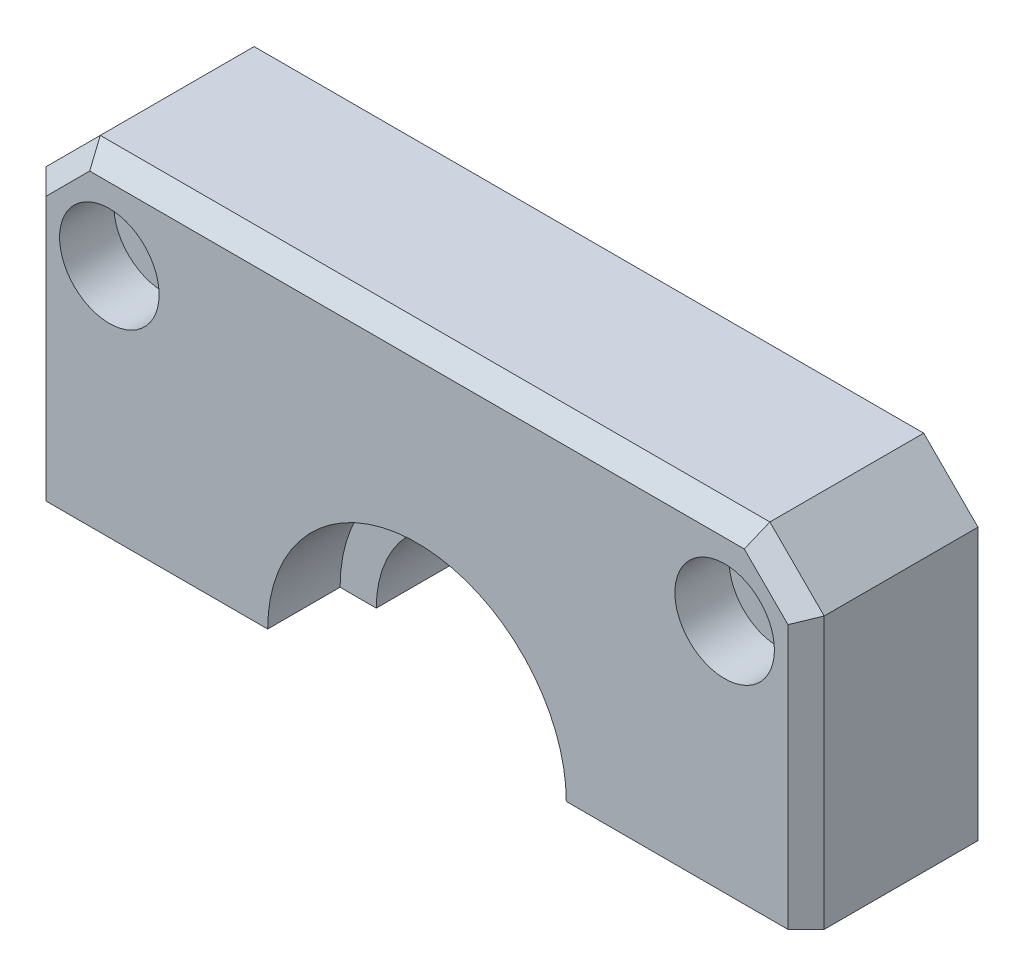
ISO-10303-21;
HEADER;
FILE_DESCRIPTION(('STEP AP214'),'2;1');
FILE_NAME('part.step','',(''),(''),'','','');
FILE_SCHEMA(('AUTOMOTIVE_DESIGN { 1 0 10303 214 1 1 1 1 }'));
ENDSEC;
DATA;
#1=APPLICATION_CONTEXT('core data for automotive mechanical design processes');
#2=APPLICATION_PROTOCOL_DEFINITION('international standard','automotive_design',2000,#1);
#3=PRODUCT_CONTEXT('',#1,'mechanical');
#4=PRODUCT('Part','Part','',(#3));
#5=PRODUCT_RELATED_PRODUCT_CATEGORY('part','',(#4));
#6=PRODUCT_DEFINITION_FORMATION('','',#4);
#7=PRODUCT_DEFINITION_CONTEXT('part definition',#1,'design');
#8=PRODUCT_DEFINITION('design','',#6,#7);
#9=PRODUCT_DEFINITION_SHAPE('','',#8);
#10=(LENGTH_UNIT() NAMED_UNIT(*) SI_UNIT(.MILLI.,.METRE.));
#11=(NAMED_UNIT(*) PLANE_ANGLE_UNIT() SI_UNIT($,.RADIAN.));
#12=(NAMED_UNIT(*) SI_UNIT($,.STERADIAN.) SOLID_ANGLE_UNIT());
#13=UNCERTAINTY_MEASURE_WITH_UNIT(LENGTH_MEASURE(1.E-05),#10,'distance_accuracy_value','');
#14=(GEOMETRIC_REPRESENTATION_CONTEXT(3) GLOBAL_UNCERTAINTY_ASSIGNED_CONTEXT((#13)) GLOBAL_UNIT_ASSIGNED_CONTEXT((#10,
#11,#12)) REPRESENTATION_CONTEXT('',''));
#15=CARTESIAN_POINT('',(0.,0.,0.));
#16=DIRECTION('',(0.,0.,1.));
#17=DIRECTION('',(1.,0.,0.));
#18=AXIS2_PLACEMENT_3D('',#15,#16,#17);
#19=CARTESIAN_POINT('',(17.,13.,58.5));
#20=DIRECTION('',(0.,0.,-1.));
#21=DIRECTION('',(-1.,0.,0.));
#22=AXIS2_PLACEMENT_3D('',#19,#20,#21);
#23=CYLINDRICAL_SURFACE('',#22,1.5);
#24=CARTESIAN_POINT('',(17.,13.,49.));
#25=DIRECTION('',(0.,0.,1.));
#26=DIRECTION('',(1.,0.,0.));
#27=AXIS2_PLACEMENT_3D('',#24,#25,#26);
#28=CIRCLE('',#27,1.5);
#29=CARTESIAN_POINT('',(18.5,13.,49.));
#30=VERTEX_POINT('',#29);
#31=EDGE_CURVE('E173',#30,#30,#28,.T.);
#32=ORIENTED_EDGE('',*,*,#31,.F.);
#33=EDGE_LOOP('',(#32));
#34=FACE_BOUND('',#33,.T.);
#35=CARTESIAN_POINT('',(17.,13.,55.5));
#36=DIRECTION('',(0.,0.,1.));
#37=DIRECTION('',(1.,0.,0.));
#38=AXIS2_PLACEMENT_3D('',#35,#36,#37);
#39=CIRCLE('',#38,1.5);
#40=CARTESIAN_POINT('',(18.5,13.,55.5));
#41=VERTEX_POINT('',#40);
#42=EDGE_CURVE('E222',#41,#41,#39,.T.);
#43=ORIENTED_EDGE('',*,*,#42,.T.);
#44=EDGE_LOOP('',(#43));
#45=FACE_BOUND('',#44,.T.);
#46=ADVANCED_FACE('F39',(#34,#45),#23,.F.);
#47=CARTESIAN_POINT('',(-17.,13.,58.5));
#48=DIRECTION('',(0.,0.,-1.));
#49=DIRECTION('',(-1.,0.,0.));
#50=AXIS2_PLACEMENT_3D('',#47,#48,#49);
#51=CYLINDRICAL_SURFACE('',#50,1.5);
#52=CARTESIAN_POINT('',(-17.,13.,49.));
#53=DIRECTION('',(0.,0.,1.));
#54=DIRECTION('',(1.,0.,0.));
#55=AXIS2_PLACEMENT_3D('',#52,#53,#54);
#56=CIRCLE('',#55,1.5);
#57=CARTESIAN_POINT('',(-15.5,13.,49.));
#58=VERTEX_POINT('',#57);
#59=EDGE_CURVE('E170',#58,#58,#56,.T.);
#60=ORIENTED_EDGE('',*,*,#59,.F.);
#61=EDGE_LOOP('',(#60));
#62=FACE_BOUND('',#61,.T.);
#63=CARTESIAN_POINT('',(-17.,13.,55.5));
#64=DIRECTION('',(0.,0.,1.));
#65=DIRECTION('',(1.,0.,0.));
#66=AXIS2_PLACEMENT_3D('',#63,#64,#65);
#67=CIRCLE('',#66,1.5);
#68=CARTESIAN_POINT('',(-15.5,13.,55.5));
#69=VERTEX_POINT('',#68);
#70=EDGE_CURVE('E217',#69,#69,#67,.T.);
#71=ORIENTED_EDGE('',*,*,#70,.T.);
#72=EDGE_LOOP('',(#71));
#73=FACE_BOUND('',#72,.T.);
#74=ADVANCED_FACE('F336',(#62,#73),#51,.F.);
#75=CARTESIAN_POINT('',(0.,0.,58.5));
#76=DIRECTION('',(0.,0.,-1.));
#77=DIRECTION('',(-1.,0.,0.));
#78=AXIS2_PLACEMENT_3D('',#75,#76,#77);
#79=CYLINDRICAL_SURFACE('',#78,6.25);
#80=CARTESIAN_POINT('',(0.,0.,54.5));
#81=DIRECTION('',(0.,0.,1.));
#82=DIRECTION('',(1.,0.,0.));
#83=AXIS2_PLACEMENT_3D('',#80,#81,#82);
#84=CIRCLE('',#83,6.25);
#85=CARTESIAN_POINT('',(-6.25,0.,54.5));
#86=VERTEX_POINT('',#85);
#87=CARTESIAN_POINT('',(6.25,0.,54.5));
#88=VERTEX_POINT('',#87);
#89=EDGE_CURVE('E142',#86,#88,#84,.F.);
#90=ORIENTED_EDGE('',*,*,#89,.F.);
#91=DIRECTION('',(0.,0.,-1.));
#92=VECTOR('',#91,1.);
#93=CARTESIAN_POINT('',(-6.25,0.,58.5));
#94=LINE('',#93,#92);
#95=CARTESIAN_POINT('',(-6.25,0.,49.));
#96=VERTEX_POINT('',#95);
#97=EDGE_CURVE('E205',#86,#96,#94,.T.);
#98=ORIENTED_EDGE('',*,*,#97,.T.);
#99=CARTESIAN_POINT('',(0.,0.,49.));
#100=DIRECTION('',(0.,0.,-1.));
#101=DIRECTION('',(1.,0.,0.));
#102=AXIS2_PLACEMENT_3D('',#99,#100,#101);
#103=CIRCLE('',#102,6.25);
#104=CARTESIAN_POINT('',(6.25,0.,49.));
#105=VERTEX_POINT('',#104);
#106=EDGE_CURVE('E192',#96,#105,#103,.T.);
#107=ORIENTED_EDGE('',*,*,#106,.T.);
#108=DIRECTION('',(0.,0.,-1.));
#109=VECTOR('',#108,1.);
#110=CARTESIAN_POINT('',(6.25,0.,58.5));
#111=LINE('',#110,#109);
#112=EDGE_CURVE('E203',#88,#105,#111,.T.);
#113=ORIENTED_EDGE('',*,*,#112,.F.);
#114=EDGE_LOOP('',(#90,#98,#107,#113));
#115=FACE_BOUND('',#114,.T.);
#116=ADVANCED_FACE('F342',(#115),#79,.F.);
#117=CARTESIAN_POINT('',(0.,18.,40.));
#118=DIRECTION('',(0.,-1.,0.));
#119=DIRECTION('',(0.,0.,-1.));
#120=AXIS2_PLACEMENT_3D('',#117,#118,#119);
#121=PLANE('',#120);
#122=DIRECTION('',(0.,0.,1.));
#123=VECTOR('',#122,1.);
#124=CARTESIAN_POINT('',(-18.5,18.,40.));
#125=LINE('',#124,#123);
#126=CARTESIAN_POINT('',(-18.5,18.,49.));
#127=VERTEX_POINT('',#126);
#128=CARTESIAN_POINT('',(-18.5,18.,57.5));
#129=VERTEX_POINT('',#128);
#130=EDGE_CURVE('E201',#127,#129,#125,.T.);
#131=ORIENTED_EDGE('',*,*,#130,.T.);
#132=DIRECTION('',(1.,0.,0.));
#133=VECTOR('',#132,1.);
#134=CARTESIAN_POINT('',(18.5,18.,57.5));
#135=LINE('',#134,#133);
#136=CARTESIAN_POINT('',(18.5,18.,57.5));
#137=VERTEX_POINT('',#136);
#138=EDGE_CURVE('E12',#129,#137,#135,.T.);
#139=ORIENTED_EDGE('',*,*,#138,.T.);
#140=DIRECTION('',(0.,0.,-1.));
#141=VECTOR('',#140,1.);
#142=CARTESIAN_POINT('',(18.5,18.,20.));
#143=LINE('',#142,#141);
#144=CARTESIAN_POINT('',(18.5,18.,49.));
#145=VERTEX_POINT('',#144);
#146=EDGE_CURVE('E214',#137,#145,#143,.T.);
#147=ORIENTED_EDGE('',*,*,#146,.T.);
#148=DIRECTION('',(-1.,0.,0.));
#149=VECTOR('',#148,1.);
#150=CARTESIAN_POINT('',(0.,18.,49.));
#151=LINE('',#150,#149);
#152=EDGE_CURVE('E180',#145,#127,#151,.T.);
#153=ORIENTED_EDGE('',*,*,#152,.T.);
#154=EDGE_LOOP('',(#131,#139,#147,#153));
#155=FACE_BOUND('',#154,.T.);
#156=ADVANCED_FACE('F303',(#155),#121,.F.);
#157=CARTESIAN_POINT('',(-21.5,0.,40.));
#158=DIRECTION('',(1.,0.,0.));
#159=DIRECTION('',(0.,1.,0.));
#160=AXIS2_PLACEMENT_3D('',#157,#158,#159);
#161=PLANE('',#160);
#162=DIRECTION('',(0.,0.,-1.));
#163=VECTOR('',#162,1.);
#164=CARTESIAN_POINT('',(-21.5,0.,58.5));
#165=LINE('',#164,#163);
#166=CARTESIAN_POINT('',(-21.5,0.,57.5));
#167=VERTEX_POINT('',#166);
#168=CARTESIAN_POINT('',(-21.5,0.,49.));
#169=VERTEX_POINT('',#168);
#170=EDGE_CURVE('E207',#167,#169,#165,.T.);
#171=ORIENTED_EDGE('',*,*,#170,.F.);
#172=DIRECTION('',(0.,1.,0.));
#173=VECTOR('',#172,1.);
#174=CARTESIAN_POINT('',(-21.5,15.,57.5));
#175=LINE('',#174,#173);
#176=CARTESIAN_POINT('',(-21.5,15.,57.5));
#177=VERTEX_POINT('',#176);
#178=EDGE_CURVE('E63',#167,#177,#175,.T.);
#179=ORIENTED_EDGE('',*,*,#178,.T.);
#180=DIRECTION('',(0.,0.,-1.));
#181=VECTOR('',#180,1.);
#182=CARTESIAN_POINT('',(-21.5,15.,40.));
#183=LINE('',#182,#181);
#184=CARTESIAN_POINT('',(-21.5,15.,49.));
#185=VERTEX_POINT('',#184);
#186=EDGE_CURVE('E212',#177,#185,#183,.T.);
#187=ORIENTED_EDGE('',*,*,#186,.T.);
#188=DIRECTION('',(0.,-1.,0.));
#189=VECTOR('',#188,1.);
#190=CARTESIAN_POINT('',(-21.5,0.,49.));
#191=LINE('',#190,#189);
#192=EDGE_CURVE('E181',#185,#169,#191,.T.);
#193=ORIENTED_EDGE('',*,*,#192,.T.);
#194=EDGE_LOOP('',(#171,#179,#187,#193));
#195=FACE_BOUND('',#194,.T.);
#196=ADVANCED_FACE('F362',(#195),#161,.F.);
#197=CARTESIAN_POINT('',(21.5,0.,40.));
#198=DIRECTION('',(1.,0.,0.));
#199=DIRECTION('',(0.,1.,0.));
#200=AXIS2_PLACEMENT_3D('',#197,#198,#199);
#201=PLANE('',#200);
#202=DIRECTION('',(0.,0.,1.));
#203=VECTOR('',#202,1.);
#204=CARTESIAN_POINT('',(21.5,15.,49.));
#205=LINE('',#204,#203);
#206=CARTESIAN_POINT('',(21.5,15.,49.));
#207=VERTEX_POINT('',#206);
#208=CARTESIAN_POINT('',(21.5,15.,57.5));
#209=VERTEX_POINT('',#208);
#210=EDGE_CURVE('E209',#207,#209,#205,.T.);
#211=ORIENTED_EDGE('',*,*,#210,.T.);
#212=DIRECTION('',(0.,-1.,0.));
#213=VECTOR('',#212,1.);
#214=CARTESIAN_POINT('',(21.5,0.,57.5));
#215=LINE('',#214,#213);
#216=CARTESIAN_POINT('',(21.5,0.,57.5));
#217=VERTEX_POINT('',#216);
#218=EDGE_CURVE('E237',#209,#217,#215,.T.);
#219=ORIENTED_EDGE('',*,*,#218,.T.);
#220=DIRECTION('',(0.,0.,-1.));
#221=VECTOR('',#220,1.);
#222=CARTESIAN_POINT('',(21.5,0.,58.5));
#223=LINE('',#222,#221);
#224=CARTESIAN_POINT('',(21.5,0.,49.));
#225=VERTEX_POINT('',#224);
#226=EDGE_CURVE('E194',#217,#225,#223,.T.);
#227=ORIENTED_EDGE('',*,*,#226,.T.);
#228=DIRECTION('',(0.,-1.,0.));
#229=VECTOR('',#228,1.);
#230=CARTESIAN_POINT('',(21.5,0.,49.));
#231=LINE('',#230,#229);
#232=EDGE_CURVE('E177',#207,#225,#231,.T.);
#233=ORIENTED_EDGE('',*,*,#232,.F.);
#234=EDGE_LOOP('',(#211,#219,#227,#233));
#235=FACE_BOUND('',#234,.T.);
#236=ADVANCED_FACE('F315',(#235),#201,.T.);
#237=CARTESIAN_POINT('',(-21.5,15.,40.));
#238=DIRECTION('',(0.707106781186547,-0.707106781186548,0.));
#239=DIRECTION('',(0.,0.,-1.));
#240=AXIS2_PLACEMENT_3D('',#237,#238,#239);
#241=PLANE('',#240);
#242=ORIENTED_EDGE('',*,*,#186,.F.);
#243=DIRECTION('',(-0.707106781186548,-0.707106781186547,0.));
#244=VECTOR('',#243,1.);
#245=CARTESIAN_POINT('',(-21.5,15.,57.5));
#246=LINE('',#245,#244);
#247=EDGE_CURVE('E48',#177,#129,#246,.F.);
#248=ORIENTED_EDGE('',*,*,#247,.T.);
#249=ORIENTED_EDGE('',*,*,#130,.F.);
#250=DIRECTION('',(-0.707106781186548,-0.707106781186547,0.));
#251=VECTOR('',#250,1.);
#252=CARTESIAN_POINT('',(-21.5,15.,49.));
#253=LINE('',#252,#251);
#254=EDGE_CURVE('E185',#185,#127,#253,.F.);
#255=ORIENTED_EDGE('',*,*,#254,.F.);
#256=EDGE_LOOP('',(#242,#248,#249,#255));
#257=FACE_BOUND('',#256,.T.);
#258=ADVANCED_FACE('F361',(#257),#241,.F.);
#259=CARTESIAN_POINT('',(18.5,18.,40.));
#260=DIRECTION('',(0.707106781186548,0.707106781186548,0.));
#261=DIRECTION('',(0.,0.,1.));
#262=AXIS2_PLACEMENT_3D('',#259,#260,#261);
#263=PLANE('',#262);
#264=ORIENTED_EDGE('',*,*,#146,.F.);
#265=DIRECTION('',(0.707106781186548,-0.707106781186548,0.));
#266=VECTOR('',#265,1.);
#267=CARTESIAN_POINT('',(18.5,18.,57.5));
#268=LINE('',#267,#266);
#269=EDGE_CURVE('E241',#137,#209,#268,.T.);
#270=ORIENTED_EDGE('',*,*,#269,.T.);
#271=ORIENTED_EDGE('',*,*,#210,.F.);
#272=DIRECTION('',(0.707106781186548,-0.707106781186548,0.));
#273=VECTOR('',#272,1.);
#274=CARTESIAN_POINT('',(18.5,18.,49.));
#275=LINE('',#274,#273);
#276=EDGE_CURVE('E176',#145,#207,#275,.T.);
#277=ORIENTED_EDGE('',*,*,#276,.F.);
#278=EDGE_LOOP('',(#264,#270,#271,#277));
#279=FACE_BOUND('',#278,.T.);
#280=ADVANCED_FACE('F290',(#279),#263,.T.);
#281=CARTESIAN_POINT('',(-6.25,0.,58.5));
#282=DIRECTION('',(0.,1.,0.));
#283=DIRECTION('',(-1.,0.,0.));
#284=AXIS2_PLACEMENT_3D('',#281,#282,#283);
#285=PLANE('',#284);
#286=CARTESIAN_POINT('',(-11.5,0.,53.75));
#287=DIRECTION('',(0.,-1.,0.));
#288=DIRECTION('',(1.,0.,0.));
#289=AXIS2_PLACEMENT_3D('',#286,#287,#288);
#290=CIRCLE('',#289,2.75);
#291=CARTESIAN_POINT('',(-8.75,0.,53.75));
#292=VERTEX_POINT('',#291);
#293=EDGE_CURVE('E276',#292,#292,#290,.T.);
#294=ORIENTED_EDGE('',*,*,#293,.F.);
#295=EDGE_LOOP('',(#294));
#296=FACE_BOUND('',#295,.T.);
#297=DIRECTION('',(1.,0.,0.));
#298=VECTOR('',#297,1.);
#299=CARTESIAN_POINT('',(-6.25,0.,58.5));
#300=LINE('',#299,#298);
#301=CARTESIAN_POINT('',(-20.5,0.,58.5));
#302=VERTEX_POINT('',#301);
#303=CARTESIAN_POINT('',(-8.25,0.,58.5));
#304=VERTEX_POINT('',#303);
#305=EDGE_CURVE('E190',#302,#304,#300,.T.);
#306=ORIENTED_EDGE('',*,*,#305,.F.);
#307=DIRECTION('',(-0.707106781186545,0.,-0.70710678118655));
#308=VECTOR('',#307,1.);
#309=CARTESIAN_POINT('',(-20.5,0.,58.5));
#310=LINE('',#309,#308);
#311=EDGE_CURVE('E243',#302,#167,#310,.T.);
#312=ORIENTED_EDGE('',*,*,#311,.T.);
#313=ORIENTED_EDGE('',*,*,#170,.T.);
#314=DIRECTION('',(1.,0.,0.));
#315=VECTOR('',#314,1.);
#316=CARTESIAN_POINT('',(-6.25,0.,49.));
#317=LINE('',#316,#315);
#318=EDGE_CURVE('E184',#169,#96,#317,.T.);
#319=ORIENTED_EDGE('',*,*,#318,.T.);
#320=ORIENTED_EDGE('',*,*,#97,.F.);
#321=DIRECTION('',(1.,0.,0.));
#322=VECTOR('',#321,1.);
#323=CARTESIAN_POINT('',(-6.25,0.,54.5));
#324=LINE('',#323,#322);
#325=CARTESIAN_POINT('',(-8.25,0.,54.5));
#326=VERTEX_POINT('',#325);
#327=EDGE_CURVE('E168',#326,#86,#324,.T.);
#328=ORIENTED_EDGE('',*,*,#327,.F.);
#329=DIRECTION('',(0.,0.,1.));
#330=VECTOR('',#329,1.);
#331=CARTESIAN_POINT('',(-8.25,0.,54.5));
#332=LINE('',#331,#330);
#333=EDGE_CURVE('E155',#326,#304,#332,.T.);
#334=ORIENTED_EDGE('',*,*,#333,.T.);
#335=EDGE_LOOP('',(#306,#312,#313,#319,#320,#328,#334));
#336=FACE_BOUND('',#335,.T.);
#337=ADVANCED_FACE('F287',(#296,#336),#285,.F.);
#338=CARTESIAN_POINT('',(21.5,0.,58.5));
#339=DIRECTION('',(0.,1.,0.));
#340=DIRECTION('',(-1.,0.,0.));
#341=AXIS2_PLACEMENT_3D('',#338,#339,#340);
#342=PLANE('',#341);
#343=CARTESIAN_POINT('',(11.5,0.,53.75));
#344=DIRECTION('',(0.,-1.,0.));
#345=DIRECTION('',(-1.,0.,0.));
#346=AXIS2_PLACEMENT_3D('',#343,#344,#345);
#347=CIRCLE('',#346,2.75);
#348=CARTESIAN_POINT('',(8.75,0.,53.75));
#349=VERTEX_POINT('',#348);
#350=EDGE_CURVE('E220',#349,#349,#347,.T.);
#351=ORIENTED_EDGE('',*,*,#350,.F.);
#352=EDGE_LOOP('',(#351));
#353=FACE_BOUND('',#352,.T.);
#354=ORIENTED_EDGE('',*,*,#226,.F.);
#355=DIRECTION('',(0.707106781186545,0.,-0.70710678118655));
#356=VECTOR('',#355,1.);
#357=CARTESIAN_POINT('',(20.5,0.,58.5));
#358=LINE('',#357,#356);
#359=CARTESIAN_POINT('',(20.5,0.,58.5));
#360=VERTEX_POINT('',#359);
#361=EDGE_CURVE('E239',#217,#360,#358,.F.);
#362=ORIENTED_EDGE('',*,*,#361,.T.);
#363=DIRECTION('',(1.,0.,0.));
#364=VECTOR('',#363,1.);
#365=CARTESIAN_POINT('',(21.5,0.,58.5));
#366=LINE('',#365,#364);
#367=CARTESIAN_POINT('',(8.25,0.,58.5));
#368=VERTEX_POINT('',#367);
#369=EDGE_CURVE('E162',#368,#360,#366,.T.);
#370=ORIENTED_EDGE('',*,*,#369,.F.);
#371=DIRECTION('',(0.,0.,1.));
#372=VECTOR('',#371,1.);
#373=CARTESIAN_POINT('',(8.25,0.,54.5));
#374=LINE('',#373,#372);
#375=CARTESIAN_POINT('',(8.25,0.,54.5));
#376=VERTEX_POINT('',#375);
#377=EDGE_CURVE('E152',#368,#376,#374,.F.);
#378=ORIENTED_EDGE('',*,*,#377,.T.);
#379=DIRECTION('',(1.,0.,0.));
#380=VECTOR('',#379,1.);
#381=CARTESIAN_POINT('',(21.5,0.,54.5));
#382=LINE('',#381,#380);
#383=EDGE_CURVE('E136',#88,#376,#382,.T.);
#384=ORIENTED_EDGE('',*,*,#383,.F.);
#385=ORIENTED_EDGE('',*,*,#112,.T.);
#386=DIRECTION('',(1.,0.,0.));
#387=VECTOR('',#386,1.);
#388=CARTESIAN_POINT('',(21.5,0.,49.));
#389=LINE('',#388,#387);
#390=EDGE_CURVE('E147',#105,#225,#389,.T.);
#391=ORIENTED_EDGE('',*,*,#390,.T.);
#392=EDGE_LOOP('',(#354,#362,#370,#378,#384,#385,#391));
#393=FACE_BOUND('',#392,.T.);
#394=ADVANCED_FACE('F160',(#353,#393),#342,.F.);
#395=CARTESIAN_POINT('',(0.,0.,58.5));
#396=DIRECTION('',(0.,0.,1.));
#397=DIRECTION('',(1.,0.,0.));
#398=AXIS2_PLACEMENT_3D('',#395,#396,#397);
#399=PLANE('',#398);
#400=ORIENTED_EDGE('',*,*,#369,.T.);
#401=DIRECTION('',(0.,1.,0.));
#402=VECTOR('',#401,1.);
#403=CARTESIAN_POINT('',(20.5,0.,58.5));
#404=LINE('',#403,#402);
#405=CARTESIAN_POINT('',(20.5,14.5857864376269,58.5));
#406=VERTEX_POINT('',#405);
#407=EDGE_CURVE('E234',#360,#406,#404,.T.);
#408=ORIENTED_EDGE('',*,*,#407,.T.);
#409=DIRECTION('',(-0.707106781186548,0.707106781186548,0.));
#410=VECTOR('',#409,1.);
#411=CARTESIAN_POINT('',(17.5428932188135,17.5428932188135,58.5));
#412=LINE('',#411,#410);
#413=CARTESIAN_POINT('',(18.0857864376269,17.,58.5));
#414=VERTEX_POINT('',#413);
#415=EDGE_CURVE('E232',#406,#414,#412,.T.);
#416=ORIENTED_EDGE('',*,*,#415,.T.);
#417=DIRECTION('',(-1.,0.,0.));
#418=VECTOR('',#417,1.);
#419=CARTESIAN_POINT('',(-18.5,17.,58.5));
#420=LINE('',#419,#418);
#421=CARTESIAN_POINT('',(-18.0857864376269,17.,58.5));
#422=VERTEX_POINT('',#421);
#423=EDGE_CURVE('E146',#414,#422,#420,.T.);
#424=ORIENTED_EDGE('',*,*,#423,.T.);
#425=DIRECTION('',(-0.707106781186548,-0.707106781186547,0.));
#426=VECTOR('',#425,1.);
#427=CARTESIAN_POINT('',(-17.5428932188135,17.5428932188135,58.5));
#428=LINE('',#427,#426);
#429=CARTESIAN_POINT('',(-20.5,14.5857864376269,58.5));
#430=VERTEX_POINT('',#429);
#431=EDGE_CURVE('E228',#422,#430,#428,.T.);
#432=ORIENTED_EDGE('',*,*,#431,.T.);
#433=DIRECTION('',(0.,-1.,0.));
#434=VECTOR('',#433,1.);
#435=CARTESIAN_POINT('',(-20.5,0.,58.5));
#436=LINE('',#435,#434);
#437=EDGE_CURVE('E230',#430,#302,#436,.T.);
#438=ORIENTED_EDGE('',*,*,#437,.T.);
#439=ORIENTED_EDGE('',*,*,#305,.T.);
#440=CARTESIAN_POINT('',(0.,0.,58.5));
#441=DIRECTION('',(0.,0.,1.));
#442=DIRECTION('',(1.,0.,0.));
#443=AXIS2_PLACEMENT_3D('',#440,#441,#442);
#444=CIRCLE('',#443,8.25);
#445=EDGE_CURVE('E156',#368,#304,#444,.T.);
#446=ORIENTED_EDGE('',*,*,#445,.F.);
#447=EDGE_LOOP('',(#400,#408,#416,#424,#432,#438,#439,#446));
#448=FACE_BOUND('',#447,.T.);
#449=CARTESIAN_POINT('',(17.,13.,58.5));
#450=DIRECTION('',(0.,0.,1.));
#451=DIRECTION('',(1.,0.,0.));
#452=AXIS2_PLACEMENT_3D('',#449,#450,#451);
#453=CIRCLE('',#452,2.75);
#454=CARTESIAN_POINT('',(19.75,13.,58.5));
#455=VERTEX_POINT('',#454);
#456=EDGE_CURVE('E258',#455,#455,#453,.T.);
#457=ORIENTED_EDGE('',*,*,#456,.F.);
#458=EDGE_LOOP('',(#457));
#459=FACE_BOUND('',#458,.T.);
#460=CARTESIAN_POINT('',(-17.,13.,58.5));
#461=DIRECTION('',(0.,0.,1.));
#462=DIRECTION('',(1.,0.,0.));
#463=AXIS2_PLACEMENT_3D('',#460,#461,#462);
#464=CIRCLE('',#463,2.75);
#465=CARTESIAN_POINT('',(-14.25,13.,58.5));
#466=VERTEX_POINT('',#465);
#467=EDGE_CURVE('E225',#466,#466,#464,.T.);
#468=ORIENTED_EDGE('',*,*,#467,.F.);
#469=EDGE_LOOP('',(#468));
#470=FACE_BOUND('',#469,.T.);
#471=ADVANCED_FACE('F323',(#448,#459,#470),#399,.T.);
#472=CARTESIAN_POINT('',(0.,0.,49.));
#473=DIRECTION('',(0.,0.,1.));
#474=DIRECTION('',(1.,0.,0.));
#475=AXIS2_PLACEMENT_3D('',#472,#473,#474);
#476=PLANE('',#475);
#477=ORIENTED_EDGE('',*,*,#106,.F.);
#478=ORIENTED_EDGE('',*,*,#318,.F.);
#479=ORIENTED_EDGE('',*,*,#192,.F.);
#480=ORIENTED_EDGE('',*,*,#254,.T.);
#481=ORIENTED_EDGE('',*,*,#152,.F.);
#482=ORIENTED_EDGE('',*,*,#276,.T.);
#483=ORIENTED_EDGE('',*,*,#232,.T.);
#484=ORIENTED_EDGE('',*,*,#390,.F.);
#485=EDGE_LOOP('',(#477,#478,#479,#480,#481,#482,#483,#484));
#486=FACE_BOUND('',#485,.T.);
#487=ORIENTED_EDGE('',*,*,#59,.T.);
#488=EDGE_LOOP('',(#487));
#489=FACE_BOUND('',#488,.T.);
#490=ORIENTED_EDGE('',*,*,#31,.T.);
#491=EDGE_LOOP('',(#490));
#492=FACE_BOUND('',#491,.T.);
#493=ADVANCED_FACE('F311',(#486,#489,#492),#476,.F.);
#494=CARTESIAN_POINT('',(0.,0.,54.5));
#495=DIRECTION('',(0.,0.,1.));
#496=DIRECTION('',(1.,0.,0.));
#497=AXIS2_PLACEMENT_3D('',#494,#495,#496);
#498=PLANE('',#497);
#499=ORIENTED_EDGE('',*,*,#327,.T.);
#500=ORIENTED_EDGE('',*,*,#89,.T.);
#501=ORIENTED_EDGE('',*,*,#383,.T.);
#502=CARTESIAN_POINT('',(0.,0.,54.5));
#503=DIRECTION('',(0.,0.,1.));
#504=DIRECTION('',(1.,0.,0.));
#505=AXIS2_PLACEMENT_3D('',#502,#503,#504);
#506=CIRCLE('',#505,8.25);
#507=EDGE_CURVE('E139',#376,#326,#506,.T.);
#508=ORIENTED_EDGE('',*,*,#507,.T.);
#509=EDGE_LOOP('',(#499,#500,#501,#508));
#510=FACE_BOUND('',#509,.T.);
#511=ADVANCED_FACE('F138',(#510),#498,.T.);
#512=CARTESIAN_POINT('',(0.,0.,54.5));
#513=DIRECTION('',(0.,0.,1.));
#514=DIRECTION('',(1.,0.,0.));
#515=AXIS2_PLACEMENT_3D('',#512,#513,#514);
#516=CYLINDRICAL_SURFACE('',#515,8.25);
#517=ORIENTED_EDGE('',*,*,#507,.F.);
#518=ORIENTED_EDGE('',*,*,#377,.F.);
#519=ORIENTED_EDGE('',*,*,#445,.T.);
#520=ORIENTED_EDGE('',*,*,#333,.F.);
#521=EDGE_LOOP('',(#517,#518,#519,#520));
#522=FACE_BOUND('',#521,.T.);
#523=ADVANCED_FACE('F150',(#522),#516,.F.);
#524=CARTESIAN_POINT('',(-11.5,6.,53.75));
#525=DIRECTION('',(0.,-1.,0.));
#526=DIRECTION('',(1.,0.,0.));
#527=AXIS2_PLACEMENT_3D('',#524,#525,#526);
#528=CYLINDRICAL_SURFACE('',#527,2.75);
#529=CARTESIAN_POINT('',(-11.5,6.,53.75));
#530=DIRECTION('',(0.,-1.,0.));
#531=DIRECTION('',(1.,0.,0.));
#532=AXIS2_PLACEMENT_3D('',#529,#530,#531);
#533=CIRCLE('',#532,2.75);
#534=CARTESIAN_POINT('',(-8.75,6.,53.75));
#535=VERTEX_POINT('',#534);
#536=EDGE_CURVE('E279',#535,#535,#533,.T.);
#537=ORIENTED_EDGE('',*,*,#536,.F.);
#538=EDGE_LOOP('',(#537));
#539=FACE_BOUND('',#538,.T.);
#540=ORIENTED_EDGE('',*,*,#293,.T.);
#541=EDGE_LOOP('',(#540));
#542=FACE_BOUND('',#541,.T.);
#543=ADVANCED_FACE('F285',(#539,#542),#528,.F.);
#544=CARTESIAN_POINT('',(-11.5,6.,53.75));
#545=DIRECTION('',(0.,-1.,0.));
#546=DIRECTION('',(1.,0.,0.));
#547=AXIS2_PLACEMENT_3D('',#544,#545,#546);
#548=PLANE('',#547);
#549=ORIENTED_EDGE('',*,*,#536,.T.);
#550=EDGE_LOOP('',(#549));
#551=FACE_BOUND('',#550,.T.);
#552=ADVANCED_FACE('F409',(#551),#548,.T.);
#553=CARTESIAN_POINT('',(11.5,6.,53.75));
#554=DIRECTION('',(0.,-1.,0.));
#555=DIRECTION('',(1.,0.,0.));
#556=AXIS2_PLACEMENT_3D('',#553,#554,#555);
#557=CYLINDRICAL_SURFACE('',#556,2.75);
#558=CARTESIAN_POINT('',(11.5,6.,53.75));
#559=DIRECTION('',(0.,-1.,0.));
#560=DIRECTION('',(-1.,0.,0.));
#561=AXIS2_PLACEMENT_3D('',#558,#559,#560);
#562=CIRCLE('',#561,2.75);
#563=CARTESIAN_POINT('',(8.75,6.,53.75));
#564=VERTEX_POINT('',#563);
#565=EDGE_CURVE('E273',#564,#564,#562,.T.);
#566=ORIENTED_EDGE('',*,*,#565,.F.);
#567=EDGE_LOOP('',(#566));
#568=FACE_BOUND('',#567,.T.);
#569=ORIENTED_EDGE('',*,*,#350,.T.);
#570=EDGE_LOOP('',(#569));
#571=FACE_BOUND('',#570,.T.);
#572=ADVANCED_FACE('F417',(#568,#571),#557,.F.);
#573=CARTESIAN_POINT('',(11.5,6.,53.75));
#574=DIRECTION('',(0.,1.,0.));
#575=DIRECTION('',(-1.,0.,0.));
#576=AXIS2_PLACEMENT_3D('',#573,#574,#575);
#577=PLANE('',#576);
#578=ORIENTED_EDGE('',*,*,#565,.T.);
#579=EDGE_LOOP('',(#578));
#580=FACE_BOUND('',#579,.T.);
#581=ADVANCED_FACE('F425',(#580),#577,.F.);
#582=CARTESIAN_POINT('',(-17.,13.,55.5));
#583=DIRECTION('',(0.,0.,1.));
#584=DIRECTION('',(1.,0.,0.));
#585=AXIS2_PLACEMENT_3D('',#582,#583,#584);
#586=CYLINDRICAL_SURFACE('',#585,2.75);
#587=CARTESIAN_POINT('',(-17.,13.,55.5));
#588=DIRECTION('',(0.,0.,1.));
#589=DIRECTION('',(1.,0.,0.));
#590=AXIS2_PLACEMENT_3D('',#587,#588,#589);
#591=CIRCLE('',#590,2.75);
#592=CARTESIAN_POINT('',(-14.25,13.,55.5));
#593=VERTEX_POINT('',#592);
#594=EDGE_CURVE('E221',#593,#593,#591,.T.);
#595=ORIENTED_EDGE('',*,*,#594,.F.);
#596=EDGE_LOOP('',(#595));
#597=FACE_BOUND('',#596,.T.);
#598=ORIENTED_EDGE('',*,*,#467,.T.);
#599=EDGE_LOOP('',(#598));
#600=FACE_BOUND('',#599,.T.);
#601=ADVANCED_FACE('F433',(#597,#600),#586,.F.);
#602=CARTESIAN_POINT('',(-17.,13.,55.5));
#603=DIRECTION('',(0.,0.,1.));
#604=DIRECTION('',(1.,0.,0.));
#605=AXIS2_PLACEMENT_3D('',#602,#603,#604);
#606=PLANE('',#605);
#607=ORIENTED_EDGE('',*,*,#70,.F.);
#608=EDGE_LOOP('',(#607));
#609=FACE_BOUND('',#608,.T.);
#610=ORIENTED_EDGE('',*,*,#594,.T.);
#611=EDGE_LOOP('',(#610));
#612=FACE_BOUND('',#611,.T.);
#613=ADVANCED_FACE('F441',(#609,#612),#606,.T.);
#614=CARTESIAN_POINT('',(17.,13.,55.5));
#615=DIRECTION('',(0.,0.,1.));
#616=DIRECTION('',(1.,0.,0.));
#617=AXIS2_PLACEMENT_3D('',#614,#615,#616);
#618=CYLINDRICAL_SURFACE('',#617,2.75);
#619=CARTESIAN_POINT('',(17.,13.,55.5));
#620=DIRECTION('',(0.,0.,1.));
#621=DIRECTION('',(1.,0.,0.));
#622=AXIS2_PLACEMENT_3D('',#619,#620,#621);
#623=CIRCLE('',#622,2.75);
#624=CARTESIAN_POINT('',(19.75,13.,55.5));
#625=VERTEX_POINT('',#624);
#626=EDGE_CURVE('E226',#625,#625,#623,.T.);
#627=ORIENTED_EDGE('',*,*,#626,.F.);
#628=EDGE_LOOP('',(#627));
#629=FACE_BOUND('',#628,.T.);
#630=ORIENTED_EDGE('',*,*,#456,.T.);
#631=EDGE_LOOP('',(#630));
#632=FACE_BOUND('',#631,.T.);
#633=ADVANCED_FACE('F450',(#629,#632),#618,.F.);
#634=CARTESIAN_POINT('',(17.,13.,55.5));
#635=DIRECTION('',(0.,0.,1.));
#636=DIRECTION('',(1.,0.,0.));
#637=AXIS2_PLACEMENT_3D('',#634,#635,#636);
#638=PLANE('',#637);
#639=ORIENTED_EDGE('',*,*,#42,.F.);
#640=EDGE_LOOP('',(#639));
#641=FACE_BOUND('',#640,.T.);
#642=ORIENTED_EDGE('',*,*,#626,.T.);
#643=EDGE_LOOP('',(#642));
#644=FACE_BOUND('',#643,.T.);
#645=ADVANCED_FACE('F458',(#641,#644),#638,.T.);
#646=CARTESIAN_POINT('',(-20.5,0.,58.5));
#647=DIRECTION('',(-0.70710678118655,0.,0.707106781186545));
#648=DIRECTION('',(0.,1.,0.));
#649=AXIS2_PLACEMENT_3D('',#646,#647,#648);
#650=PLANE('',#649);
#651=ORIENTED_EDGE('',*,*,#311,.F.);
#652=ORIENTED_EDGE('',*,*,#437,.F.);
#653=DIRECTION('',(0.678598344545845,-0.281084637714817,0.67859834454585));
#654=VECTOR('',#653,1.);
#655=CARTESIAN_POINT('',(-19.7023141075424,14.2553741224573,59.2976858924577));
#656=LINE('',#655,#654);
#657=EDGE_CURVE('E43',#177,#430,#656,.T.);
#658=ORIENTED_EDGE('',*,*,#657,.F.);
#659=ORIENTED_EDGE('',*,*,#178,.F.);
#660=EDGE_LOOP('',(#651,#652,#658,#659));
#661=FACE_BOUND('',#660,.T.);
#662=ADVANCED_FACE('F41',(#661),#650,.T.);
#663=CARTESIAN_POINT('',(-17.5428932188135,17.5428932188135,58.5));
#664=DIRECTION('',(-0.500000000000002,0.500000000000003,0.707106781186544));
#665=DIRECTION('',(0.707106781186548,0.707106781186547,0.));
#666=AXIS2_PLACEMENT_3D('',#663,#664,#665);
#667=PLANE('',#666);
#668=ORIENTED_EDGE('',*,*,#657,.T.);
#669=ORIENTED_EDGE('',*,*,#431,.F.);
#670=DIRECTION('',(0.281084637714817,-0.678598344545845,0.67859834454585));
#671=VECTOR('',#670,1.);
#672=CARTESIAN_POINT('',(-16.6568542494924,13.5502525316942,61.9497474683058));
#673=LINE('',#672,#671);
#674=EDGE_CURVE('E251',#129,#422,#673,.T.);
#675=ORIENTED_EDGE('',*,*,#674,.F.);
#676=ORIENTED_EDGE('',*,*,#247,.F.);
#677=EDGE_LOOP('',(#668,#669,#675,#676));
#678=FACE_BOUND('',#677,.T.);
#679=ADVANCED_FACE('F297',(#678),#667,.T.);
#680=CARTESIAN_POINT('',(0.,17.,58.5));
#681=DIRECTION('',(0.,0.70710678118655,0.707106781186545));
#682=DIRECTION('',(1.,0.,0.));
#683=AXIS2_PLACEMENT_3D('',#680,#681,#682);
#684=PLANE('',#683);
#685=ORIENTED_EDGE('',*,*,#674,.T.);
#686=ORIENTED_EDGE('',*,*,#423,.F.);
#687=DIRECTION('',(-0.281084637714826,-0.678598344545844,0.678598344545848));
#688=VECTOR('',#687,1.);
#689=CARTESIAN_POINT('',(16.6568542494923,13.5502525316941,61.9497474683059));
#690=LINE('',#689,#688);
#691=EDGE_CURVE('E249',#137,#414,#690,.T.);
#692=ORIENTED_EDGE('',*,*,#691,.F.);
#693=ORIENTED_EDGE('',*,*,#138,.F.);
#694=EDGE_LOOP('',(#685,#686,#692,#693));
#695=FACE_BOUND('',#694,.T.);
#696=ADVANCED_FACE('F299',(#695),#684,.T.);
#697=CARTESIAN_POINT('',(17.5428932188135,17.5428932188135,58.5));
#698=DIRECTION('',(-0.5,-0.5,-0.707106781186548));
#699=DIRECTION('',(-0.707106781186548,0.707106781186548,0.));
#700=AXIS2_PLACEMENT_3D('',#697,#698,#699);
#701=PLANE('',#700);
#702=ORIENTED_EDGE('',*,*,#691,.T.);
#703=ORIENTED_EDGE('',*,*,#415,.F.);
#704=DIRECTION('',(0.678598344545843,0.281084637714826,-0.678598344545848));
#705=VECTOR('',#704,1.);
#706=CARTESIAN_POINT('',(19.7023141075424,14.2553741224573,59.2976858924576));
#707=LINE('',#706,#705);
#708=EDGE_CURVE('E247',#209,#406,#707,.F.);
#709=ORIENTED_EDGE('',*,*,#708,.F.);
#710=ORIENTED_EDGE('',*,*,#269,.F.);
#711=EDGE_LOOP('',(#702,#703,#709,#710));
#712=FACE_BOUND('',#711,.T.);
#713=ADVANCED_FACE('F326',(#712),#701,.F.);
#714=CARTESIAN_POINT('',(20.5,0.,58.5));
#715=DIRECTION('',(-0.70710678118655,0.,-0.707106781186545));
#716=DIRECTION('',(0.,1.,0.));
#717=AXIS2_PLACEMENT_3D('',#714,#715,#716);
#718=PLANE('',#717);
#719=ORIENTED_EDGE('',*,*,#361,.F.);
#720=ORIENTED_EDGE('',*,*,#218,.F.);
#721=ORIENTED_EDGE('',*,*,#708,.T.);
#722=ORIENTED_EDGE('',*,*,#407,.F.);
#723=EDGE_LOOP('',(#719,#720,#721,#722));
#724=FACE_BOUND('',#723,.T.);
#725=ADVANCED_FACE('F320',(#724),#718,.F.);
#726=CLOSED_SHELL('',(#46,#74,#116,#156,#196,#236,#258,#280,#337,#394,#471,#493,#511,#523,#543,
#552,#572,#581,#601,#613,#633,#645,#662,#679,#696,#713,#725));
#727=MANIFOLD_SOLID_BREP('B2',#726);
#728=ADVANCED_BREP_SHAPE_REPRESENTATION('',(#18,#727),#14);
#729=SHAPE_DEFINITION_REPRESENTATION(#9,#728);
ENDSEC;
END-ISO-10303-21;
